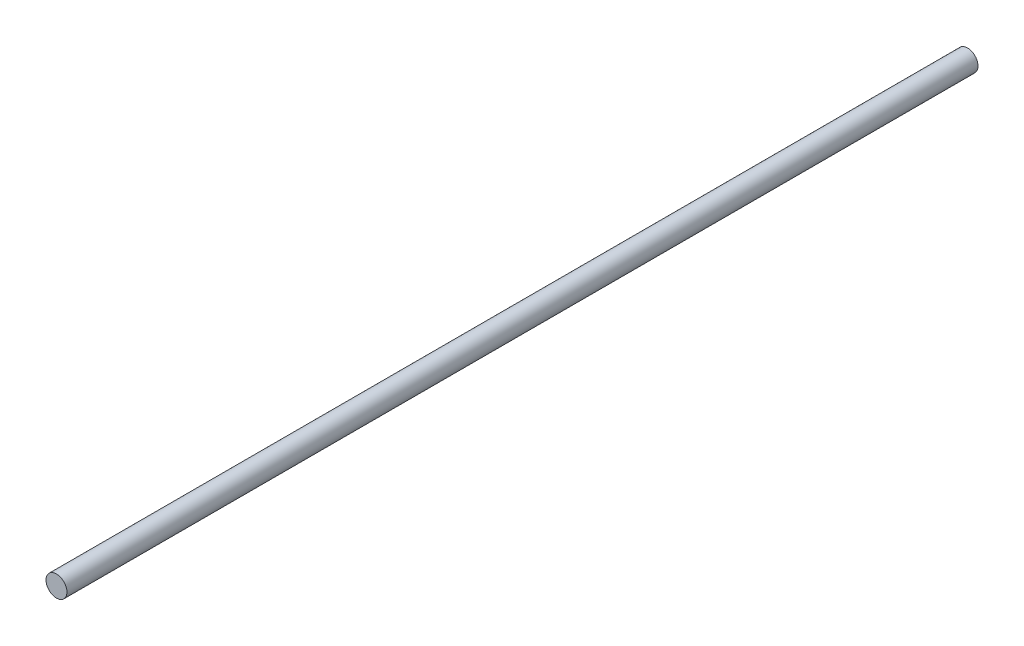
ISO-10303-21;
HEADER;
FILE_DESCRIPTION(('STEP AP214'),'2;1');
FILE_NAME('part.step','',(''),(''),'','','');
FILE_SCHEMA(('AUTOMOTIVE_DESIGN { 1 0 10303 214 1 1 1 1 }'));
ENDSEC;
DATA;
#1=APPLICATION_CONTEXT('core data for automotive mechanical design processes');
#2=APPLICATION_PROTOCOL_DEFINITION('international standard','automotive_design',2000,#1);
#3=PRODUCT_CONTEXT('',#1,'mechanical');
#4=PRODUCT('Part','Part','',(#3));
#5=PRODUCT_RELATED_PRODUCT_CATEGORY('part','',(#4));
#6=PRODUCT_DEFINITION_FORMATION('','',#4);
#7=PRODUCT_DEFINITION_CONTEXT('part definition',#1,'design');
#8=PRODUCT_DEFINITION('design','',#6,#7);
#9=PRODUCT_DEFINITION_SHAPE('','',#8);
#10=(LENGTH_UNIT() NAMED_UNIT(*) SI_UNIT(.MILLI.,.METRE.));
#11=(NAMED_UNIT(*) PLANE_ANGLE_UNIT() SI_UNIT($,.RADIAN.));
#12=(NAMED_UNIT(*) SI_UNIT($,.STERADIAN.) SOLID_ANGLE_UNIT());
#13=UNCERTAINTY_MEASURE_WITH_UNIT(LENGTH_MEASURE(1.E-05),#10,'distance_accuracy_value','');
#14=(GEOMETRIC_REPRESENTATION_CONTEXT(3) GLOBAL_UNCERTAINTY_ASSIGNED_CONTEXT((#13)) GLOBAL_UNIT_ASSIGNED_CONTEXT((#10,
#11,#12)) REPRESENTATION_CONTEXT('',''));
#15=CARTESIAN_POINT('',(0.,0.,0.));
#16=DIRECTION('',(0.,0.,1.));
#17=DIRECTION('',(1.,0.,0.));
#18=AXIS2_PLACEMENT_3D('',#15,#16,#17);
#19=CARTESIAN_POINT('',(0.,0.,25.));
#20=DIRECTION('',(0.,0.,1.));
#21=DIRECTION('',(1.,0.,0.));
#22=AXIS2_PLACEMENT_3D('',#19,#20,#21);
#23=PLANE('',#22);
#24=CARTESIAN_POINT('',(0.,0.,25.));
#25=DIRECTION('',(0.,0.,1.));
#26=DIRECTION('',(1.,0.,0.));
#27=AXIS2_PLACEMENT_3D('',#24,#25,#26);
#28=CIRCLE('',#27,0.27);
#29=CARTESIAN_POINT('',(-0.27,0.,25.));
#30=VERTEX_POINT('',#29);
#31=EDGE_CURVE('E20',#30,#30,#28,.T.);
#32=ORIENTED_EDGE('',*,*,#31,.T.);
#33=EDGE_LOOP('',(#32));
#34=FACE_BOUND('',#33,.T.);
#35=ADVANCED_FACE('F16',(#34),#23,.T.);
#36=CARTESIAN_POINT('',(0.,0.,0.));
#37=DIRECTION('',(0.,0.,1.));
#38=DIRECTION('',(1.,0.,0.));
#39=AXIS2_PLACEMENT_3D('',#36,#37,#38);
#40=CYLINDRICAL_SURFACE('',#39,0.27);
#41=ORIENTED_EDGE('',*,*,#31,.F.);
#42=DIRECTION('',(0.,0.,-1.));
#43=VECTOR('',#42,1.);
#44=CARTESIAN_POINT('',(-0.27,0.,0.));
#45=LINE('',#44,#43);
#46=CARTESIAN_POINT('',(-0.27,0.,1.5));
#47=VERTEX_POINT('',#46);
#48=EDGE_CURVE('E11',#30,#47,#45,.T.);
#49=ORIENTED_EDGE('',*,*,#48,.T.);
#50=CARTESIAN_POINT('',(0.,0.,1.5));
#51=DIRECTION('',(0.,0.,1.));
#52=DIRECTION('',(1.,0.,0.));
#53=AXIS2_PLACEMENT_3D('',#50,#51,#52);
#54=CIRCLE('',#53,0.27);
#55=EDGE_CURVE('E41',#47,#47,#54,.T.);
#56=ORIENTED_EDGE('',*,*,#55,.T.);
#57=ORIENTED_EDGE('',*,*,#48,.F.);
#58=EDGE_LOOP('',(#41,#49,#56,#57));
#59=FACE_BOUND('',#58,.T.);
#60=ADVANCED_FACE('F39',(#59),#40,.T.);
#61=CARTESIAN_POINT('',(0.,0.,1.5));
#62=DIRECTION('',(0.,0.,1.));
#63=DIRECTION('',(1.,0.,0.));
#64=AXIS2_PLACEMENT_3D('',#61,#62,#63);
#65=PLANE('',#64);
#66=ORIENTED_EDGE('',*,*,#55,.F.);
#67=EDGE_LOOP('',(#66));
#68=FACE_BOUND('',#67,.T.);
#69=ADVANCED_FACE('F18',(#68),#65,.F.);
#70=CLOSED_SHELL('',(#35,#60,#69));
#71=MANIFOLD_SOLID_BREP('B1',#70);
#72=ADVANCED_BREP_SHAPE_REPRESENTATION('',(#18,#71),#14);
#73=SHAPE_DEFINITION_REPRESENTATION(#9,#72);
ENDSEC;
END-ISO-10303-21;
